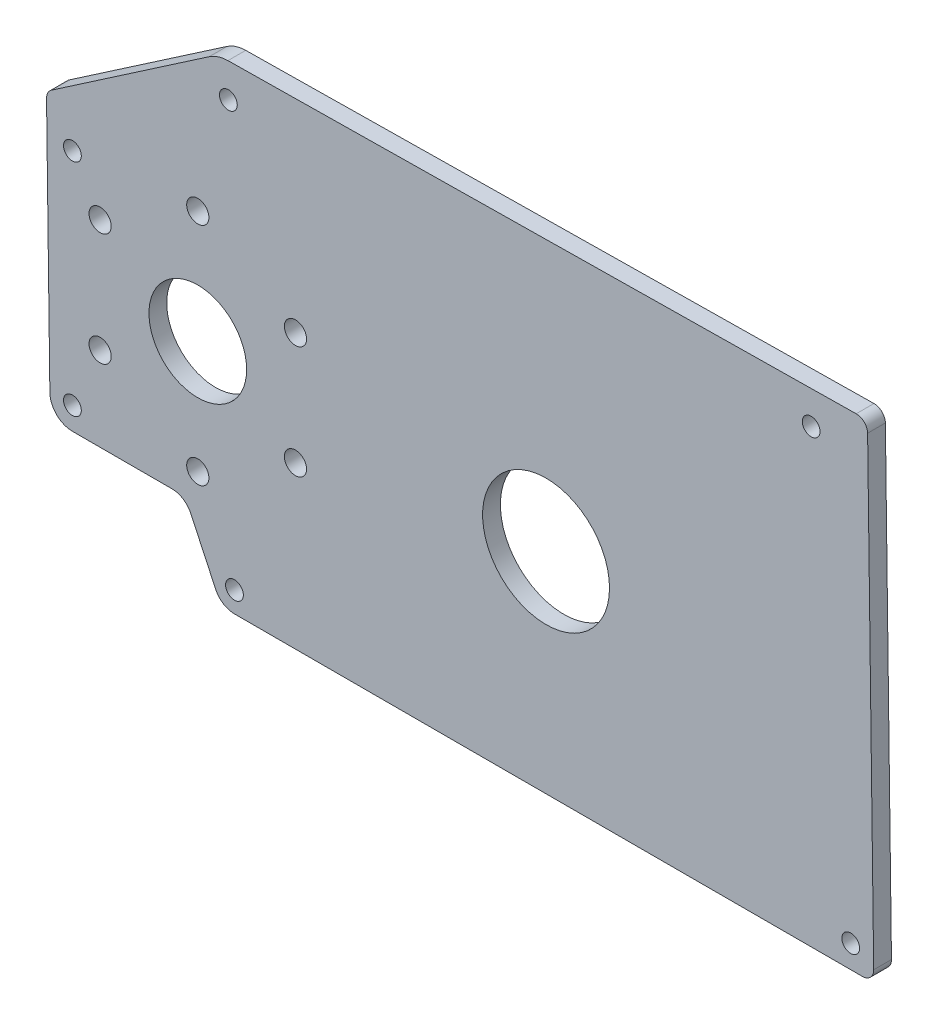
ISO-10303-21;
HEADER;
FILE_DESCRIPTION(('STEP AP214'),'2;1');
FILE_NAME('part.step','',(''),(''),'','','');
FILE_SCHEMA(('AUTOMOTIVE_DESIGN { 1 0 10303 214 1 1 1 1 }'));
ENDSEC;
DATA;
#1=APPLICATION_CONTEXT('core data for automotive mechanical design processes');
#2=APPLICATION_PROTOCOL_DEFINITION('international standard','automotive_design',2000,#1);
#3=PRODUCT_CONTEXT('',#1,'mechanical');
#4=PRODUCT('Part','Part','',(#3));
#5=PRODUCT_RELATED_PRODUCT_CATEGORY('part','',(#4));
#6=PRODUCT_DEFINITION_FORMATION('','',#4);
#7=PRODUCT_DEFINITION_CONTEXT('part definition',#1,'design');
#8=PRODUCT_DEFINITION('design','',#6,#7);
#9=PRODUCT_DEFINITION_SHAPE('','',#8);
#10=(LENGTH_UNIT() NAMED_UNIT(*) SI_UNIT(.MILLI.,.METRE.));
#11=(NAMED_UNIT(*) PLANE_ANGLE_UNIT() SI_UNIT($,.RADIAN.));
#12=(NAMED_UNIT(*) SI_UNIT($,.STERADIAN.) SOLID_ANGLE_UNIT());
#13=UNCERTAINTY_MEASURE_WITH_UNIT(LENGTH_MEASURE(1.E-05),#10,'distance_accuracy_value','');
#14=(GEOMETRIC_REPRESENTATION_CONTEXT(3) GLOBAL_UNCERTAINTY_ASSIGNED_CONTEXT((#13)) GLOBAL_UNIT_ASSIGNED_CONTEXT((#10,
#11,#12)) REPRESENTATION_CONTEXT('',''));
#15=CARTESIAN_POINT('',(0.,0.,0.));
#16=DIRECTION('',(0.,0.,1.));
#17=DIRECTION('',(1.,0.,0.));
#18=AXIS2_PLACEMENT_3D('',#15,#16,#17);
#19=CARTESIAN_POINT('',(30.2662459890792,33.6255082547779,4.));
#20=DIRECTION('',(0.,0.,1.));
#21=DIRECTION('',(1.,0.,0.));
#22=AXIS2_PLACEMENT_3D('',#19,#20,#21);
#23=PLANE('',#22);
#24=CARTESIAN_POINT('',(23.3772099057697,-16.9102078282391,4.));
#25=DIRECTION('',(0.,0.,1.));
#26=DIRECTION('',(1.,0.,0.));
#27=AXIS2_PLACEMENT_3D('',#24,#25,#26);
#28=CIRCLE('',#27,11.);
#29=CARTESIAN_POINT('',(34.3772099057697,-16.9102078282391,4.));
#30=VERTEX_POINT('',#29);
#31=EDGE_CURVE('E346',#30,#30,#28,.T.);
#32=ORIENTED_EDGE('',*,*,#31,.F.);
#33=EDGE_LOOP('',(#32));
#34=FACE_BOUND('',#33,.T.);
#35=CARTESIAN_POINT('',(23.3772099057698,8.48979217176094,4.));
#36=DIRECTION('',(0.,0.,1.));
#37=DIRECTION('',(1.,0.,0.));
#38=AXIS2_PLACEMENT_3D('',#35,#36,#37);
#39=CIRCLE('',#38,2.499999953);
#40=CARTESIAN_POINT('',(25.8772098587698,8.48979217176094,4.));
#41=VERTEX_POINT('',#40);
#42=EDGE_CURVE('E334',#41,#41,#39,.T.);
#43=ORIENTED_EDGE('',*,*,#42,.F.);
#44=EDGE_LOOP('',(#43));
#45=FACE_BOUND('',#44,.T.);
#46=CARTESIAN_POINT('',(23.3772099057697,-42.3102078282391,4.));
#47=DIRECTION('',(0.,0.,1.));
#48=DIRECTION('',(1.,0.,0.));
#49=AXIS2_PLACEMENT_3D('',#46,#47,#48);
#50=CIRCLE('',#49,2.499999953);
#51=CARTESIAN_POINT('',(25.8772098587697,-42.3102078282391,4.));
#52=VERTEX_POINT('',#51);
#53=EDGE_CURVE('E322',#52,#52,#50,.T.);
#54=ORIENTED_EDGE('',*,*,#53,.F.);
#55=EDGE_LOOP('',(#54));
#56=FACE_BOUND('',#55,.T.);
#57=CARTESIAN_POINT('',(1.38016464964489,-29.610207828239,4.));
#58=DIRECTION('',(0.,0.,1.));
#59=DIRECTION('',(1.,0.,0.));
#60=AXIS2_PLACEMENT_3D('',#57,#58,#59);
#61=CIRCLE('',#60,2.499999953);
#62=CARTESIAN_POINT('',(3.8801646026449,-29.610207828239,4.));
#63=VERTEX_POINT('',#62);
#64=EDGE_CURVE('E310',#63,#63,#61,.T.);
#65=ORIENTED_EDGE('',*,*,#64,.F.);
#66=EDGE_LOOP('',(#65));
#67=FACE_BOUND('',#66,.T.);
#68=CARTESIAN_POINT('',(-4.85811183989235,6.1453174279259,4.));
#69=DIRECTION('',(0.,0.,1.));
#70=DIRECTION('',(1.,0.,0.));
#71=AXIS2_PLACEMENT_3D('',#68,#69,#70);
#72=CIRCLE('',#71,2.);
#73=CARTESIAN_POINT('',(-2.85811183989235,6.1453174279259,4.));
#74=VERTEX_POINT('',#73);
#75=EDGE_CURVE('E298',#74,#74,#72,.T.);
#76=ORIENTED_EDGE('',*,*,#75,.F.);
#77=EDGE_LOOP('',(#76));
#78=FACE_BOUND('',#77,.T.);
#79=CARTESIAN_POINT('',(31.6332520207642,-61.2646579872688,4.));
#80=DIRECTION('',(0.,0.,1.));
#81=DIRECTION('',(1.,0.,0.));
#82=AXIS2_PLACEMENT_3D('',#79,#80,#81);
#83=CIRCLE('',#82,1.99999999999876);
#84=CARTESIAN_POINT('',(33.633252020763,-61.2646579872688,4.));
#85=VERTEX_POINT('',#84);
#86=EDGE_CURVE('E286',#85,#85,#83,.T.);
#87=ORIENTED_EDGE('',*,*,#86,.F.);
#88=EDGE_LOOP('',(#87));
#89=FACE_BOUND('',#88,.T.);
#90=CARTESIAN_POINT('',(101.811349412124,-18.6490529622797,4.));
#91=DIRECTION('',(0.,0.,1.));
#92=DIRECTION('',(1.,0.,0.));
#93=AXIS2_PLACEMENT_3D('',#90,#91,#92);
#94=CIRCLE('',#93,14.29);
#95=CARTESIAN_POINT('',(116.101349412124,-18.6490529622797,4.));
#96=VERTEX_POINT('',#95);
#97=EDGE_CURVE('E170',#96,#96,#94,.T.);
#98=ORIENTED_EDGE('',*,*,#97,.F.);
#99=EDGE_LOOP('',(#98));
#100=FACE_BOUND('',#99,.T.);
#101=DIRECTION('',(-0.825412157107729,-0.564530575698754,0.));
#102=VECTOR('',#101,1.);
#103=CARTESIAN_POINT('',(-6.61983482671686,17.6294748495068,4.));
#104=LINE('',#103,#102);
#105=CARTESIAN_POINT('',(25.9645230022547,39.9151488919387,4.));
#106=VERTEX_POINT('',#105);
#107=CARTESIAN_POINT('',(-9.58296343211521,15.6028791868787,4.));
#108=VERTEX_POINT('',#107);
#109=EDGE_CURVE('E51',#106,#108,#104,.T.);
#110=ORIENTED_EDGE('',*,*,#109,.T.);
#111=CARTESIAN_POINT('',(-8.14905576984035,13.5063323078251,4.));
#112=DIRECTION('',(0.,0.,1.));
#113=DIRECTION('',(-1.,0.,0.));
#114=AXIS2_PLACEMENT_3D('',#111,#112,#113);
#115=CIRCLE('',#114,2.54000000000003);
#116=CARTESIAN_POINT('',(-10.6888352442123,13.4728625967584,4.));
#117=VERTEX_POINT('',#116);
#118=EDGE_CURVE('E273',#108,#117,#115,.T.);
#119=ORIENTED_EDGE('',*,*,#118,.T.);
#120=DIRECTION('',(0.013177051601079,-0.999913178886598,0.));
#121=VECTOR('',#120,1.);
#122=CARTESIAN_POINT('',(-10.6888352442123,13.4728625967584,4.));
#123=LINE('',#122,#121);
#124=CARTESIAN_POINT('',(-9.93811183989234,-43.494222939777,4.));
#125=VERTEX_POINT('',#124);
#126=EDGE_CURVE('E227',#117,#125,#123,.T.);
#127=ORIENTED_EDGE('',*,*,#126,.T.);
#128=CARTESIAN_POINT('',(-4.85811183989235,-43.494222939777,4.));
#129=DIRECTION('',(0.,0.,1.));
#130=DIRECTION('',(-1.,0.,0.));
#131=AXIS2_PLACEMENT_3D('',#128,#129,#130);
#132=CIRCLE('',#131,5.07999999999999);
#133=CARTESIAN_POINT('',(-4.85811183989251,-48.574222939777,4.));
#134=VERTEX_POINT('',#133);
#135=EDGE_CURVE('E249',#125,#134,#132,.T.);
#136=ORIENTED_EDGE('',*,*,#135,.T.);
#137=DIRECTION('',(1.,0.,0.));
#138=VECTOR('',#137,1.);
#139=CARTESIAN_POINT('',(17.5661326864003,-48.574222939777,4.));
#140=LINE('',#139,#138);
#141=CARTESIAN_POINT('',(17.5661326864003,-48.574222939777,4.));
#142=VERTEX_POINT('',#141);
#143=EDGE_CURVE('E246',#134,#142,#140,.T.);
#144=ORIENTED_EDGE('',*,*,#143,.T.);
#145=CARTESIAN_POINT('',(17.5661326864003,-53.2486600238922,4.));
#146=DIRECTION('',(0.,0.,-1.));
#147=DIRECTION('',(1.,0.,0.));
#148=AXIS2_PLACEMENT_3D('',#145,#146,#147);
#149=CIRCLE('',#148,4.67443708411522);
#150=CARTESIAN_POINT('',(21.8007320590548,-51.2691322502892,4.));
#151=VERTEX_POINT('',#150);
#152=EDGE_CURVE('E248',#142,#151,#149,.T.);
#153=ORIENTED_EDGE('',*,*,#152,.T.);
#154=DIRECTION('',(0.423479391845908,-0.90590573719445,0.));
#155=VECTOR('',#154,1.);
#156=CARTESIAN_POINT('',(21.8007320590548,-51.2691322502892,4.));
#157=LINE('',#156,#155);
#158=CARTESIAN_POINT('',(27.3986526481097,-63.2441857608719,4.));
#159=VERTEX_POINT('',#158);
#160=EDGE_CURVE('E251',#151,#159,#157,.T.);
#161=ORIENTED_EDGE('',*,*,#160,.T.);
#162=CARTESIAN_POINT('',(31.6332520207642,-61.2646579872688,4.));
#163=DIRECTION('',(0.,0.,1.));
#164=DIRECTION('',(-1.,0.,0.));
#165=AXIS2_PLACEMENT_3D('',#162,#163,#164);
#166=CIRCLE('',#165,4.67443708411522);
#167=CARTESIAN_POINT('',(31.6332520207642,-65.9390950713841,4.));
#168=VERTEX_POINT('',#167);
#169=EDGE_CURVE('E257',#159,#168,#166,.T.);
#170=ORIENTED_EDGE('',*,*,#169,.T.);
#171=DIRECTION('',(1.,0.,0.));
#172=VECTOR('',#171,1.);
#173=CARTESIAN_POINT('',(31.6332520207642,-65.9390950713841,4.));
#174=LINE('',#173,#172);
#175=CARTESIAN_POINT('',(173.06117084053,-65.9390950713841,4.));
#176=VERTEX_POINT('',#175);
#177=EDGE_CURVE('E259',#168,#176,#174,.T.);
#178=ORIENTED_EDGE('',*,*,#177,.T.);
#179=CARTESIAN_POINT('',(173.06117084053,-63.3990950713841,4.));
#180=DIRECTION('',(0.,0.,1.));
#181=DIRECTION('',(1.,0.,0.));
#182=AXIS2_PLACEMENT_3D('',#179,#180,#181);
#183=CIRCLE('',#182,2.54);
#184=CARTESIAN_POINT('',(175.600950314902,-63.3656253603173,4.));
#185=VERTEX_POINT('',#184);
#186=EDGE_CURVE('E261',#176,#185,#183,.T.);
#187=ORIENTED_EDGE('',*,*,#186,.T.);
#188=DIRECTION('',(-0.0131770516010996,0.999913178886598,0.));
#189=VECTOR('',#188,1.);
#190=CARTESIAN_POINT('',(174.230829536448,40.6031428069106,4.));
#191=LINE('',#190,#189);
#192=CARTESIAN_POINT('',(174.230829536448,40.6031428069106,4.));
#193=VERTEX_POINT('',#192);
#194=EDGE_CURVE('E147',#185,#193,#191,.T.);
#195=ORIENTED_EDGE('',*,*,#194,.T.);
#196=CARTESIAN_POINT('',(171.691050062076,40.5696730958434,4.));
#197=DIRECTION('',(0.,0.,1.));
#198=DIRECTION('',(1.,0.,0.));
#199=AXIS2_PLACEMENT_3D('',#196,#197,#198);
#200=CIRCLE('',#199,2.54000000000014);
#201=CARTESIAN_POINT('',(171.657580351009,43.1094525702157,4.));
#202=VERTEX_POINT('',#201);
#203=EDGE_CURVE('E141',#193,#202,#200,.T.);
#204=ORIENTED_EDGE('',*,*,#203,.T.);
#205=DIRECTION('',(-0.999913178886598,-0.0131770516010816,0.));
#206=VECTOR('',#205,1.);
#207=CARTESIAN_POINT('',(30.1658368558789,41.2448466778937,4.));
#208=LINE('',#207,#206);
#209=CARTESIAN_POINT('',(30.1658368558789,41.2448466778937,4.));
#210=VERTEX_POINT('',#209);
#211=EDGE_CURVE('E145',#202,#210,#208,.T.);
#212=ORIENTED_EDGE('',*,*,#211,.T.);
#213=CARTESIAN_POINT('',(30.2662459890792,33.6255082547779,4.));
#214=DIRECTION('',(0.,0.,1.));
#215=DIRECTION('',(1.,0.,0.));
#216=AXIS2_PLACEMENT_3D('',#213,#214,#215);
#217=CIRCLE('',#216,7.61999999999999);
#218=EDGE_CURVE('E161',#210,#106,#217,.T.);
#219=ORIENTED_EDGE('',*,*,#218,.T.);
#220=EDGE_LOOP('',(#110,#119,#127,#136,#144,#153,#161,#170,#178,#187,#195,#204,#212,#219));
#221=FACE_BOUND('',#220,.T.);
#222=CARTESIAN_POINT('',(170.426367514816,-60.7757569411194,4.));
#223=DIRECTION('',(0.,0.,1.));
#224=DIRECTION('',(1.,0.,0.));
#225=AXIS2_PLACEMENT_3D('',#222,#223,#224);
#226=CIRCLE('',#225,2.);
#227=CARTESIAN_POINT('',(172.426367514816,-60.7757569411194,4.));
#228=VERTEX_POINT('',#227);
#229=EDGE_CURVE('E280',#228,#228,#226,.T.);
#230=ORIENTED_EDGE('',*,*,#229,.F.);
#231=EDGE_LOOP('',(#230));
#232=FACE_BOUND('',#231,.T.);
#233=CARTESIAN_POINT('',(161.513898191031,35.5525164901844,4.));
#234=DIRECTION('',(0.,0.,1.));
#235=DIRECTION('',(1.,0.,0.));
#236=AXIS2_PLACEMENT_3D('',#233,#234,#235);
#237=CIRCLE('',#236,2.);
#238=CARTESIAN_POINT('',(163.513898191031,35.5525164901844,4.));
#239=VERTEX_POINT('',#238);
#240=EDGE_CURVE('E292',#239,#239,#237,.T.);
#241=ORIENTED_EDGE('',*,*,#240,.F.);
#242=EDGE_LOOP('',(#241));
#243=FACE_BOUND('',#242,.T.);
#244=CARTESIAN_POINT('',(-4.85811183989235,-43.494222939777,4.));
#245=DIRECTION('',(0.,0.,1.));
#246=DIRECTION('',(1.,0.,0.));
#247=AXIS2_PLACEMENT_3D('',#244,#245,#246);
#248=CIRCLE('',#247,2.);
#249=CARTESIAN_POINT('',(-2.85811183989234,-43.494222939777,4.));
#250=VERTEX_POINT('',#249);
#251=EDGE_CURVE('E304',#250,#250,#248,.T.);
#252=ORIENTED_EDGE('',*,*,#251,.F.);
#253=EDGE_LOOP('',(#252));
#254=FACE_BOUND('',#253,.T.);
#255=CARTESIAN_POINT('',(30.2662459890792,33.6255082547779,4.));
#256=DIRECTION('',(0.,0.,1.));
#257=DIRECTION('',(1.,0.,0.));
#258=AXIS2_PLACEMENT_3D('',#255,#256,#257);
#259=CIRCLE('',#258,1.99999999998389);
#260=CARTESIAN_POINT('',(32.2662459890631,33.6255082547779,4.));
#261=VERTEX_POINT('',#260);
#262=EDGE_CURVE('E316',#261,#261,#259,.T.);
#263=ORIENTED_EDGE('',*,*,#262,.F.);
#264=EDGE_LOOP('',(#263));
#265=FACE_BOUND('',#264,.T.);
#266=CARTESIAN_POINT('',(1.38016464964499,-4.21020782823896,4.));
#267=DIRECTION('',(0.,0.,1.));
#268=DIRECTION('',(1.,0.,0.));
#269=AXIS2_PLACEMENT_3D('',#266,#267,#268);
#270=CIRCLE('',#269,2.499999953);
#271=CARTESIAN_POINT('',(3.880164602645,-4.21020782823896,4.));
#272=VERTEX_POINT('',#271);
#273=EDGE_CURVE('E328',#272,#272,#270,.T.);
#274=ORIENTED_EDGE('',*,*,#273,.F.);
#275=EDGE_LOOP('',(#274));
#276=FACE_BOUND('',#275,.T.);
#277=CARTESIAN_POINT('',(45.3742551618945,-4.21020782823927,4.));
#278=DIRECTION('',(0.,0.,1.));
#279=DIRECTION('',(1.,0.,0.));
#280=AXIS2_PLACEMENT_3D('',#277,#278,#279);
#281=CIRCLE('',#280,2.499999953);
#282=CARTESIAN_POINT('',(47.8742551148945,-4.21020782823927,4.));
#283=VERTEX_POINT('',#282);
#284=EDGE_CURVE('E340',#283,#283,#281,.T.);
#285=ORIENTED_EDGE('',*,*,#284,.F.);
#286=EDGE_LOOP('',(#285));
#287=FACE_BOUND('',#286,.T.);
#288=CARTESIAN_POINT('',(45.3742551618942,-29.6102078282393,4.));
#289=DIRECTION('',(0.,0.,1.));
#290=DIRECTION('',(1.,0.,0.));
#291=AXIS2_PLACEMENT_3D('',#288,#289,#290);
#292=CIRCLE('',#291,2.499999953);
#293=CARTESIAN_POINT('',(47.8742551148943,-29.6102078282393,4.));
#294=VERTEX_POINT('',#293);
#295=EDGE_CURVE('E352',#294,#294,#292,.T.);
#296=ORIENTED_EDGE('',*,*,#295,.F.);
#297=EDGE_LOOP('',(#296));
#298=FACE_BOUND('',#297,.T.);
#299=ADVANCED_FACE('F34',(#34,#45,#56,#67,#78,#89,#100,#221,#232,#243,#254,#265,#276,#287,#298),
#23,.T.);
#300=CARTESIAN_POINT('',(30.2662459890792,33.6255082547779,0.));
#301=DIRECTION('',(0.,0.,1.));
#302=DIRECTION('',(1.,0.,0.));
#303=AXIS2_PLACEMENT_3D('',#300,#301,#302);
#304=PLANE('',#303);
#305=CARTESIAN_POINT('',(-8.14905576984035,13.5063323078251,0.));
#306=DIRECTION('',(0.,0.,1.));
#307=DIRECTION('',(-1.,0.,0.));
#308=AXIS2_PLACEMENT_3D('',#305,#306,#307);
#309=CIRCLE('',#308,2.54000000000003);
#310=CARTESIAN_POINT('',(-9.58296343211521,15.6028791868787,0.));
#311=VERTEX_POINT('',#310);
#312=CARTESIAN_POINT('',(-10.6888352442123,13.4728625967584,0.));
#313=VERTEX_POINT('',#312);
#314=EDGE_CURVE('E167',#311,#313,#309,.T.);
#315=ORIENTED_EDGE('',*,*,#314,.F.);
#316=DIRECTION('',(-0.825412157107728,-0.564530575698754,0.));
#317=VECTOR('',#316,1.);
#318=CARTESIAN_POINT('',(16.768305703793,33.6255082547779,0.));
#319=LINE('',#318,#317);
#320=CARTESIAN_POINT('',(25.9645230022547,39.9151488919387,0.));
#321=VERTEX_POINT('',#320);
#322=EDGE_CURVE('E192',#321,#311,#319,.T.);
#323=ORIENTED_EDGE('',*,*,#322,.F.);
#324=CARTESIAN_POINT('',(30.2662459890792,33.6255082547779,0.));
#325=DIRECTION('',(0.,0.,1.));
#326=DIRECTION('',(1.,0.,0.));
#327=AXIS2_PLACEMENT_3D('',#324,#325,#326);
#328=CIRCLE('',#327,7.61999999999999);
#329=CARTESIAN_POINT('',(30.1658368558789,41.2448466778937,0.));
#330=VERTEX_POINT('',#329);
#331=EDGE_CURVE('E106',#330,#321,#328,.T.);
#332=ORIENTED_EDGE('',*,*,#331,.F.);
#333=DIRECTION('',(-0.999913178886598,-0.0131770516010816,0.));
#334=VECTOR('',#333,1.);
#335=CARTESIAN_POINT('',(30.1658368558789,41.2448466778937,0.));
#336=LINE('',#335,#334);
#337=CARTESIAN_POINT('',(171.657580351009,43.1094525702157,0.));
#338=VERTEX_POINT('',#337);
#339=EDGE_CURVE('E99',#338,#330,#336,.T.);
#340=ORIENTED_EDGE('',*,*,#339,.F.);
#341=CARTESIAN_POINT('',(171.691050062076,40.5696730958434,0.));
#342=DIRECTION('',(0.,0.,1.));
#343=DIRECTION('',(1.,0.,0.));
#344=AXIS2_PLACEMENT_3D('',#341,#342,#343);
#345=CIRCLE('',#344,2.54000000000014);
#346=CARTESIAN_POINT('',(174.230829536448,40.6031428069106,0.));
#347=VERTEX_POINT('',#346);
#348=EDGE_CURVE('E155',#347,#338,#345,.T.);
#349=ORIENTED_EDGE('',*,*,#348,.F.);
#350=DIRECTION('',(-0.0131770516010996,0.999913178886598,0.));
#351=VECTOR('',#350,1.);
#352=CARTESIAN_POINT('',(174.230829536448,40.6031428069106,0.));
#353=LINE('',#352,#351);
#354=CARTESIAN_POINT('',(175.600950314902,-63.3656253603173,0.));
#355=VERTEX_POINT('',#354);
#356=EDGE_CURVE('E187',#355,#347,#353,.T.);
#357=ORIENTED_EDGE('',*,*,#356,.F.);
#358=CARTESIAN_POINT('',(173.06117084053,-63.3990950713841,0.));
#359=DIRECTION('',(0.,0.,1.));
#360=DIRECTION('',(1.,0.,0.));
#361=AXIS2_PLACEMENT_3D('',#358,#359,#360);
#362=CIRCLE('',#361,2.54);
#363=CARTESIAN_POINT('',(173.06117084053,-65.9390950713841,0.));
#364=VERTEX_POINT('',#363);
#365=EDGE_CURVE('E185',#364,#355,#362,.T.);
#366=ORIENTED_EDGE('',*,*,#365,.F.);
#367=DIRECTION('',(1.,0.,0.));
#368=VECTOR('',#367,1.);
#369=CARTESIAN_POINT('',(66.5235655991573,-65.9390950713841,0.));
#370=LINE('',#369,#368);
#371=CARTESIAN_POINT('',(31.6332520207642,-65.9390950713841,0.));
#372=VERTEX_POINT('',#371);
#373=EDGE_CURVE('E183',#372,#364,#370,.T.);
#374=ORIENTED_EDGE('',*,*,#373,.F.);
#375=CARTESIAN_POINT('',(31.6332520207642,-61.2646579872688,0.));
#376=DIRECTION('',(0.,0.,1.));
#377=DIRECTION('',(-1.,0.,0.));
#378=AXIS2_PLACEMENT_3D('',#375,#376,#377);
#379=CIRCLE('',#378,4.67443708411522);
#380=CARTESIAN_POINT('',(27.3986526481097,-63.2441857608719,0.));
#381=VERTEX_POINT('',#380);
#382=EDGE_CURVE('E180',#381,#372,#379,.T.);
#383=ORIENTED_EDGE('',*,*,#382,.F.);
#384=DIRECTION('',(0.423479391845908,-0.90590573719445,0.));
#385=VECTOR('',#384,1.);
#386=CARTESIAN_POINT('',(21.8007320590548,-51.2691322502892,0.));
#387=LINE('',#386,#385);
#388=CARTESIAN_POINT('',(21.8007320590548,-51.2691322502892,0.));
#389=VERTEX_POINT('',#388);
#390=EDGE_CURVE('E178',#389,#381,#387,.T.);
#391=ORIENTED_EDGE('',*,*,#390,.F.);
#392=CARTESIAN_POINT('',(17.5661326864003,-53.2486600238922,0.));
#393=DIRECTION('',(0.,0.,-1.));
#394=DIRECTION('',(1.,0.,0.));
#395=AXIS2_PLACEMENT_3D('',#392,#393,#394);
#396=CIRCLE('',#395,4.67443708411522);
#397=CARTESIAN_POINT('',(17.5661326864003,-48.574222939777,0.));
#398=VERTEX_POINT('',#397);
#399=EDGE_CURVE('E176',#398,#389,#396,.T.);
#400=ORIENTED_EDGE('',*,*,#399,.F.);
#401=DIRECTION('',(1.,0.,0.));
#402=VECTOR('',#401,1.);
#403=CARTESIAN_POINT('',(17.5661326864003,-48.574222939777,0.));
#404=LINE('',#403,#402);
#405=CARTESIAN_POINT('',(-4.85811183989251,-48.574222939777,0.));
#406=VERTEX_POINT('',#405);
#407=EDGE_CURVE('E174',#406,#398,#404,.T.);
#408=ORIENTED_EDGE('',*,*,#407,.F.);
#409=CARTESIAN_POINT('',(-4.85811183989235,-43.494222939777,0.));
#410=DIRECTION('',(0.,0.,1.));
#411=DIRECTION('',(-1.,0.,0.));
#412=AXIS2_PLACEMENT_3D('',#409,#410,#411);
#413=CIRCLE('',#412,5.07999999999999);
#414=CARTESIAN_POINT('',(-9.93811183989234,-43.494222939777,0.));
#415=VERTEX_POINT('',#414);
#416=EDGE_CURVE('E172',#415,#406,#413,.T.);
#417=ORIENTED_EDGE('',*,*,#416,.F.);
#418=DIRECTION('',(0.013177051601079,-0.999913178886598,0.));
#419=VECTOR('',#418,1.);
#420=CARTESIAN_POINT('',(-10.6888352442123,13.4728625967584,0.));
#421=LINE('',#420,#419);
#422=EDGE_CURVE('E169',#313,#415,#421,.T.);
#423=ORIENTED_EDGE('',*,*,#422,.F.);
#424=EDGE_LOOP('',(#315,#323,#332,#340,#349,#357,#366,#374,#383,#391,#400,#408,#417,#423));
#425=FACE_BOUND('',#424,.T.);
#426=CARTESIAN_POINT('',(101.811349412124,-18.6490529622797,0.));
#427=DIRECTION('',(0.,0.,1.));
#428=DIRECTION('',(1.,0.,0.));
#429=AXIS2_PLACEMENT_3D('',#426,#427,#428);
#430=CIRCLE('',#429,14.29);
#431=CARTESIAN_POINT('',(116.101349412124,-18.6490529622797,0.));
#432=VERTEX_POINT('',#431);
#433=EDGE_CURVE('E277',#432,#432,#430,.T.);
#434=ORIENTED_EDGE('',*,*,#433,.T.);
#435=EDGE_LOOP('',(#434));
#436=FACE_BOUND('',#435,.T.);
#437=CARTESIAN_POINT('',(170.426367514816,-60.7757569411194,0.));
#438=DIRECTION('',(0.,0.,1.));
#439=DIRECTION('',(1.,0.,0.));
#440=AXIS2_PLACEMENT_3D('',#437,#438,#439);
#441=CIRCLE('',#440,2.);
#442=CARTESIAN_POINT('',(172.426367514816,-60.7757569411194,0.));
#443=VERTEX_POINT('',#442);
#444=EDGE_CURVE('E283',#443,#443,#441,.T.);
#445=ORIENTED_EDGE('',*,*,#444,.T.);
#446=EDGE_LOOP('',(#445));
#447=FACE_BOUND('',#446,.T.);
#448=CARTESIAN_POINT('',(31.6332520207642,-61.2646579872688,0.));
#449=DIRECTION('',(0.,0.,1.));
#450=DIRECTION('',(1.,0.,0.));
#451=AXIS2_PLACEMENT_3D('',#448,#449,#450);
#452=CIRCLE('',#451,1.99999999999876);
#453=CARTESIAN_POINT('',(33.633252020763,-61.2646579872688,0.));
#454=VERTEX_POINT('',#453);
#455=EDGE_CURVE('E289',#454,#454,#452,.T.);
#456=ORIENTED_EDGE('',*,*,#455,.T.);
#457=EDGE_LOOP('',(#456));
#458=FACE_BOUND('',#457,.T.);
#459=CARTESIAN_POINT('',(161.513898191031,35.5525164901844,0.));
#460=DIRECTION('',(0.,0.,1.));
#461=DIRECTION('',(1.,0.,0.));
#462=AXIS2_PLACEMENT_3D('',#459,#460,#461);
#463=CIRCLE('',#462,2.);
#464=CARTESIAN_POINT('',(163.513898191031,35.5525164901844,0.));
#465=VERTEX_POINT('',#464);
#466=EDGE_CURVE('E295',#465,#465,#463,.T.);
#467=ORIENTED_EDGE('',*,*,#466,.T.);
#468=EDGE_LOOP('',(#467));
#469=FACE_BOUND('',#468,.T.);
#470=CARTESIAN_POINT('',(-4.85811183989235,6.1453174279259,0.));
#471=DIRECTION('',(0.,0.,1.));
#472=DIRECTION('',(1.,0.,0.));
#473=AXIS2_PLACEMENT_3D('',#470,#471,#472);
#474=CIRCLE('',#473,2.);
#475=CARTESIAN_POINT('',(-2.85811183989235,6.1453174279259,0.));
#476=VERTEX_POINT('',#475);
#477=EDGE_CURVE('E301',#476,#476,#474,.T.);
#478=ORIENTED_EDGE('',*,*,#477,.T.);
#479=EDGE_LOOP('',(#478));
#480=FACE_BOUND('',#479,.T.);
#481=CARTESIAN_POINT('',(-4.85811183989235,-43.494222939777,0.));
#482=DIRECTION('',(0.,0.,1.));
#483=DIRECTION('',(1.,0.,0.));
#484=AXIS2_PLACEMENT_3D('',#481,#482,#483);
#485=CIRCLE('',#484,2.);
#486=CARTESIAN_POINT('',(-2.85811183989234,-43.494222939777,0.));
#487=VERTEX_POINT('',#486);
#488=EDGE_CURVE('E307',#487,#487,#485,.T.);
#489=ORIENTED_EDGE('',*,*,#488,.T.);
#490=EDGE_LOOP('',(#489));
#491=FACE_BOUND('',#490,.T.);
#492=CARTESIAN_POINT('',(1.38016464964489,-29.610207828239,0.));
#493=DIRECTION('',(0.,0.,1.));
#494=DIRECTION('',(1.,0.,0.));
#495=AXIS2_PLACEMENT_3D('',#492,#493,#494);
#496=CIRCLE('',#495,2.499999953);
#497=CARTESIAN_POINT('',(3.8801646026449,-29.610207828239,0.));
#498=VERTEX_POINT('',#497);
#499=EDGE_CURVE('E313',#498,#498,#496,.T.);
#500=ORIENTED_EDGE('',*,*,#499,.T.);
#501=EDGE_LOOP('',(#500));
#502=FACE_BOUND('',#501,.T.);
#503=CARTESIAN_POINT('',(30.2662459890792,33.6255082547779,0.));
#504=DIRECTION('',(0.,0.,1.));
#505=DIRECTION('',(1.,0.,0.));
#506=AXIS2_PLACEMENT_3D('',#503,#504,#505);
#507=CIRCLE('',#506,1.99999999998389);
#508=CARTESIAN_POINT('',(32.2662459890631,33.6255082547779,0.));
#509=VERTEX_POINT('',#508);
#510=EDGE_CURVE('E319',#509,#509,#507,.T.);
#511=ORIENTED_EDGE('',*,*,#510,.T.);
#512=EDGE_LOOP('',(#511));
#513=FACE_BOUND('',#512,.T.);
#514=CARTESIAN_POINT('',(23.3772099057697,-42.3102078282391,0.));
#515=DIRECTION('',(0.,0.,1.));
#516=DIRECTION('',(1.,0.,0.));
#517=AXIS2_PLACEMENT_3D('',#514,#515,#516);
#518=CIRCLE('',#517,2.499999953);
#519=CARTESIAN_POINT('',(25.8772098587697,-42.3102078282391,0.));
#520=VERTEX_POINT('',#519);
#521=EDGE_CURVE('E325',#520,#520,#518,.T.);
#522=ORIENTED_EDGE('',*,*,#521,.T.);
#523=EDGE_LOOP('',(#522));
#524=FACE_BOUND('',#523,.T.);
#525=CARTESIAN_POINT('',(1.38016464964499,-4.21020782823896,0.));
#526=DIRECTION('',(0.,0.,1.));
#527=DIRECTION('',(1.,0.,0.));
#528=AXIS2_PLACEMENT_3D('',#525,#526,#527);
#529=CIRCLE('',#528,2.499999953);
#530=CARTESIAN_POINT('',(3.880164602645,-4.21020782823896,0.));
#531=VERTEX_POINT('',#530);
#532=EDGE_CURVE('E331',#531,#531,#529,.T.);
#533=ORIENTED_EDGE('',*,*,#532,.T.);
#534=EDGE_LOOP('',(#533));
#535=FACE_BOUND('',#534,.T.);
#536=CARTESIAN_POINT('',(23.3772099057698,8.48979217176094,0.));
#537=DIRECTION('',(0.,0.,1.));
#538=DIRECTION('',(1.,0.,0.));
#539=AXIS2_PLACEMENT_3D('',#536,#537,#538);
#540=CIRCLE('',#539,2.499999953);
#541=CARTESIAN_POINT('',(25.8772098587698,8.48979217176094,0.));
#542=VERTEX_POINT('',#541);
#543=EDGE_CURVE('E337',#542,#542,#540,.T.);
#544=ORIENTED_EDGE('',*,*,#543,.T.);
#545=EDGE_LOOP('',(#544));
#546=FACE_BOUND('',#545,.T.);
#547=CARTESIAN_POINT('',(45.3742551618945,-4.21020782823927,0.));
#548=DIRECTION('',(0.,0.,1.));
#549=DIRECTION('',(1.,0.,0.));
#550=AXIS2_PLACEMENT_3D('',#547,#548,#549);
#551=CIRCLE('',#550,2.499999953);
#552=CARTESIAN_POINT('',(47.8742551148945,-4.21020782823927,0.));
#553=VERTEX_POINT('',#552);
#554=EDGE_CURVE('E343',#553,#553,#551,.T.);
#555=ORIENTED_EDGE('',*,*,#554,.T.);
#556=EDGE_LOOP('',(#555));
#557=FACE_BOUND('',#556,.T.);
#558=CARTESIAN_POINT('',(23.3772099057697,-16.9102078282391,0.));
#559=DIRECTION('',(0.,0.,1.));
#560=DIRECTION('',(1.,0.,0.));
#561=AXIS2_PLACEMENT_3D('',#558,#559,#560);
#562=CIRCLE('',#561,11.);
#563=CARTESIAN_POINT('',(34.3772099057697,-16.9102078282391,0.));
#564=VERTEX_POINT('',#563);
#565=EDGE_CURVE('E349',#564,#564,#562,.T.);
#566=ORIENTED_EDGE('',*,*,#565,.T.);
#567=EDGE_LOOP('',(#566));
#568=FACE_BOUND('',#567,.T.);
#569=CARTESIAN_POINT('',(45.3742551618942,-29.6102078282393,0.));
#570=DIRECTION('',(0.,0.,1.));
#571=DIRECTION('',(1.,0.,0.));
#572=AXIS2_PLACEMENT_3D('',#569,#570,#571);
#573=CIRCLE('',#572,2.499999953);
#574=CARTESIAN_POINT('',(47.8742551148943,-29.6102078282393,0.));
#575=VERTEX_POINT('',#574);
#576=EDGE_CURVE('E355',#575,#575,#573,.T.);
#577=ORIENTED_EDGE('',*,*,#576,.T.);
#578=EDGE_LOOP('',(#577));
#579=FACE_BOUND('',#578,.T.);
#580=ADVANCED_FACE('F233',(#425,#436,#447,#458,#469,#480,#491,#502,#513,#524,#535,#546,#557,
#568,#579),#304,.F.);
#581=CARTESIAN_POINT('',(-8.14905576984035,13.5063323078251,4.));
#582=DIRECTION('',(0.,0.,-1.));
#583=DIRECTION('',(-1.,0.,0.));
#584=AXIS2_PLACEMENT_3D('',#581,#582,#583);
#585=CYLINDRICAL_SURFACE('',#584,2.54000000000003);
#586=ORIENTED_EDGE('',*,*,#314,.T.);
#587=DIRECTION('',(0.,0.,-1.));
#588=VECTOR('',#587,1.);
#589=CARTESIAN_POINT('',(-10.6888352442123,13.4728625967584,4.));
#590=LINE('',#589,#588);
#591=EDGE_CURVE('E43',#117,#313,#590,.T.);
#592=ORIENTED_EDGE('',*,*,#591,.F.);
#593=ORIENTED_EDGE('',*,*,#118,.F.);
#594=DIRECTION('',(0.,0.,-1.));
#595=VECTOR('',#594,1.);
#596=CARTESIAN_POINT('',(-9.58296343211521,15.6028791868787,4.));
#597=LINE('',#596,#595);
#598=EDGE_CURVE('E11',#108,#311,#597,.T.);
#599=ORIENTED_EDGE('',*,*,#598,.T.);
#600=EDGE_LOOP('',(#586,#592,#593,#599));
#601=FACE_BOUND('',#600,.T.);
#602=ADVANCED_FACE('F36',(#601),#585,.T.);
#603=CARTESIAN_POINT('',(-10.6888352442123,13.4728625967584,4.));
#604=DIRECTION('',(0.999913178886599,0.013177051601079,0.));
#605=DIRECTION('',(-0.013177051601079,0.999913178886598,0.));
#606=AXIS2_PLACEMENT_3D('',#603,#604,#605);
#607=PLANE('',#606);
#608=ORIENTED_EDGE('',*,*,#422,.T.);
#609=DIRECTION('',(0.,0.,-1.));
#610=VECTOR('',#609,1.);
#611=CARTESIAN_POINT('',(-9.93811183989234,-43.494222939777,4.));
#612=LINE('',#611,#610);
#613=EDGE_CURVE('E218',#125,#415,#612,.T.);
#614=ORIENTED_EDGE('',*,*,#613,.F.);
#615=ORIENTED_EDGE('',*,*,#126,.F.);
#616=ORIENTED_EDGE('',*,*,#591,.T.);
#617=EDGE_LOOP('',(#608,#614,#615,#616));
#618=FACE_BOUND('',#617,.T.);
#619=ADVANCED_FACE('F225',(#618),#607,.F.);
#620=CARTESIAN_POINT('',(-4.85811183989235,-43.494222939777,4.));
#621=DIRECTION('',(0.,0.,-1.));
#622=DIRECTION('',(-1.,0.,0.));
#623=AXIS2_PLACEMENT_3D('',#620,#621,#622);
#624=CYLINDRICAL_SURFACE('',#623,5.07999999999999);
#625=ORIENTED_EDGE('',*,*,#416,.T.);
#626=DIRECTION('',(0.,0.,-1.));
#627=VECTOR('',#626,1.);
#628=CARTESIAN_POINT('',(-4.85811183989251,-48.574222939777,4.));
#629=LINE('',#628,#627);
#630=EDGE_CURVE('E215',#134,#406,#629,.T.);
#631=ORIENTED_EDGE('',*,*,#630,.F.);
#632=ORIENTED_EDGE('',*,*,#135,.F.);
#633=ORIENTED_EDGE('',*,*,#613,.T.);
#634=EDGE_LOOP('',(#625,#631,#632,#633));
#635=FACE_BOUND('',#634,.T.);
#636=ADVANCED_FACE('F240',(#635),#624,.T.);
#637=CARTESIAN_POINT('',(17.5661326864003,-48.574222939777,4.));
#638=DIRECTION('',(0.,1.,0.));
#639=DIRECTION('',(-1.,0.,0.));
#640=AXIS2_PLACEMENT_3D('',#637,#638,#639);
#641=PLANE('',#640);
#642=ORIENTED_EDGE('',*,*,#407,.T.);
#643=DIRECTION('',(0.,0.,-1.));
#644=VECTOR('',#643,1.);
#645=CARTESIAN_POINT('',(17.5661326864003,-48.574222939777,4.));
#646=LINE('',#645,#644);
#647=EDGE_CURVE('E212',#142,#398,#646,.T.);
#648=ORIENTED_EDGE('',*,*,#647,.F.);
#649=ORIENTED_EDGE('',*,*,#143,.F.);
#650=ORIENTED_EDGE('',*,*,#630,.T.);
#651=EDGE_LOOP('',(#642,#648,#649,#650));
#652=FACE_BOUND('',#651,.T.);
#653=ADVANCED_FACE('F244',(#652),#641,.F.);
#654=CARTESIAN_POINT('',(17.5661326864003,-53.2486600238922,4.));
#655=DIRECTION('',(0.,0.,-1.));
#656=DIRECTION('',(-1.,0.,0.));
#657=AXIS2_PLACEMENT_3D('',#654,#655,#656);
#658=CYLINDRICAL_SURFACE('',#657,4.67443708411522);
#659=ORIENTED_EDGE('',*,*,#399,.T.);
#660=DIRECTION('',(0.,0.,-1.));
#661=VECTOR('',#660,1.);
#662=CARTESIAN_POINT('',(21.8007320590548,-51.2691322502892,4.));
#663=LINE('',#662,#661);
#664=EDGE_CURVE('E209',#151,#389,#663,.T.);
#665=ORIENTED_EDGE('',*,*,#664,.F.);
#666=ORIENTED_EDGE('',*,*,#152,.F.);
#667=ORIENTED_EDGE('',*,*,#647,.T.);
#668=EDGE_LOOP('',(#659,#665,#666,#667));
#669=FACE_BOUND('',#668,.T.);
#670=ADVANCED_FACE('F401',(#669),#658,.F.);
#671=CARTESIAN_POINT('',(21.8007320590548,-51.2691322502892,4.));
#672=DIRECTION('',(0.90590573719445,0.423479391845908,0.));
#673=DIRECTION('',(-0.423479391845908,0.90590573719445,0.));
#674=AXIS2_PLACEMENT_3D('',#671,#672,#673);
#675=PLANE('',#674);
#676=ORIENTED_EDGE('',*,*,#390,.T.);
#677=DIRECTION('',(0.,0.,-1.));
#678=VECTOR('',#677,1.);
#679=CARTESIAN_POINT('',(27.3986526481097,-63.2441857608719,4.));
#680=LINE('',#679,#678);
#681=EDGE_CURVE('E206',#159,#381,#680,.T.);
#682=ORIENTED_EDGE('',*,*,#681,.F.);
#683=ORIENTED_EDGE('',*,*,#160,.F.);
#684=ORIENTED_EDGE('',*,*,#664,.T.);
#685=EDGE_LOOP('',(#676,#682,#683,#684));
#686=FACE_BOUND('',#685,.T.);
#687=ADVANCED_FACE('F397',(#686),#675,.F.);
#688=CARTESIAN_POINT('',(31.6332520207642,-61.2646579872688,4.));
#689=DIRECTION('',(0.,0.,-1.));
#690=DIRECTION('',(-1.,0.,0.));
#691=AXIS2_PLACEMENT_3D('',#688,#689,#690);
#692=CYLINDRICAL_SURFACE('',#691,4.67443708411522);
#693=ORIENTED_EDGE('',*,*,#382,.T.);
#694=DIRECTION('',(0.,0.,-1.));
#695=VECTOR('',#694,1.);
#696=CARTESIAN_POINT('',(31.6332520207642,-65.9390950713841,4.));
#697=LINE('',#696,#695);
#698=EDGE_CURVE('E203',#168,#372,#697,.T.);
#699=ORIENTED_EDGE('',*,*,#698,.F.);
#700=ORIENTED_EDGE('',*,*,#169,.F.);
#701=ORIENTED_EDGE('',*,*,#681,.T.);
#702=EDGE_LOOP('',(#693,#699,#700,#701));
#703=FACE_BOUND('',#702,.T.);
#704=ADVANCED_FACE('F393',(#703),#692,.T.);
#705=CARTESIAN_POINT('',(66.5235655991573,-65.9390950713841,4.));
#706=DIRECTION('',(0.,1.,0.));
#707=DIRECTION('',(-1.,0.,0.));
#708=AXIS2_PLACEMENT_3D('',#705,#706,#707);
#709=PLANE('',#708);
#710=ORIENTED_EDGE('',*,*,#373,.T.);
#711=DIRECTION('',(0.,0.,-1.));
#712=VECTOR('',#711,1.);
#713=CARTESIAN_POINT('',(173.06117084053,-65.9390950713841,4.));
#714=LINE('',#713,#712);
#715=EDGE_CURVE('E200',#176,#364,#714,.T.);
#716=ORIENTED_EDGE('',*,*,#715,.F.);
#717=ORIENTED_EDGE('',*,*,#177,.F.);
#718=ORIENTED_EDGE('',*,*,#698,.T.);
#719=EDGE_LOOP('',(#710,#716,#717,#718));
#720=FACE_BOUND('',#719,.T.);
#721=ADVANCED_FACE('F390',(#720),#709,.F.);
#722=CARTESIAN_POINT('',(173.06117084053,-63.3990950713841,4.));
#723=DIRECTION('',(0.,0.,-1.));
#724=DIRECTION('',(-1.,0.,0.));
#725=AXIS2_PLACEMENT_3D('',#722,#723,#724);
#726=CYLINDRICAL_SURFACE('',#725,2.54);
#727=ORIENTED_EDGE('',*,*,#365,.T.);
#728=DIRECTION('',(0.,0.,-1.));
#729=VECTOR('',#728,1.);
#730=CARTESIAN_POINT('',(175.600950314902,-63.3656253603173,4.));
#731=LINE('',#730,#729);
#732=EDGE_CURVE('E197',#185,#355,#731,.T.);
#733=ORIENTED_EDGE('',*,*,#732,.F.);
#734=ORIENTED_EDGE('',*,*,#186,.F.);
#735=ORIENTED_EDGE('',*,*,#715,.T.);
#736=EDGE_LOOP('',(#727,#733,#734,#735));
#737=FACE_BOUND('',#736,.T.);
#738=ADVANCED_FACE('F267',(#737),#726,.T.);
#739=CARTESIAN_POINT('',(174.230829536448,40.6031428069106,4.));
#740=DIRECTION('',(-0.999913178886598,-0.0131770516010996,0.));
#741=DIRECTION('',(0.0131770516010996,-0.999913178886598,0.));
#742=AXIS2_PLACEMENT_3D('',#739,#740,#741);
#743=PLANE('',#742);
#744=ORIENTED_EDGE('',*,*,#356,.T.);
#745=DIRECTION('',(0.,0.,-1.));
#746=VECTOR('',#745,1.);
#747=CARTESIAN_POINT('',(174.230829536448,40.6031428069106,4.));
#748=LINE('',#747,#746);
#749=EDGE_CURVE('E156',#193,#347,#748,.T.);
#750=ORIENTED_EDGE('',*,*,#749,.F.);
#751=ORIENTED_EDGE('',*,*,#194,.F.);
#752=ORIENTED_EDGE('',*,*,#732,.T.);
#753=EDGE_LOOP('',(#744,#750,#751,#752));
#754=FACE_BOUND('',#753,.T.);
#755=ADVANCED_FACE('F271',(#754),#743,.F.);
#756=CARTESIAN_POINT('',(171.691050062076,40.5696730958434,4.));
#757=DIRECTION('',(0.,0.,-1.));
#758=DIRECTION('',(-1.,0.,0.));
#759=AXIS2_PLACEMENT_3D('',#756,#757,#758);
#760=CYLINDRICAL_SURFACE('',#759,2.54000000000014);
#761=ORIENTED_EDGE('',*,*,#348,.T.);
#762=DIRECTION('',(0.,0.,-1.));
#763=VECTOR('',#762,1.);
#764=CARTESIAN_POINT('',(171.657580351009,43.1094525702157,4.));
#765=LINE('',#764,#763);
#766=EDGE_CURVE('E152',#202,#338,#765,.T.);
#767=ORIENTED_EDGE('',*,*,#766,.F.);
#768=ORIENTED_EDGE('',*,*,#203,.F.);
#769=ORIENTED_EDGE('',*,*,#749,.T.);
#770=EDGE_LOOP('',(#761,#767,#768,#769));
#771=FACE_BOUND('',#770,.T.);
#772=ADVANCED_FACE('F153',(#771),#760,.T.);
#773=CARTESIAN_POINT('',(30.1658368558789,41.2448466778937,4.));
#774=DIRECTION('',(0.0131770516010816,-0.999913178886599,0.));
#775=DIRECTION('',(0.999913178886598,0.0131770516010816,0.));
#776=AXIS2_PLACEMENT_3D('',#773,#774,#775);
#777=PLANE('',#776);
#778=ORIENTED_EDGE('',*,*,#339,.T.);
#779=DIRECTION('',(0.,0.,-1.));
#780=VECTOR('',#779,1.);
#781=CARTESIAN_POINT('',(30.1658368558789,41.2448466778937,4.));
#782=LINE('',#781,#780);
#783=EDGE_CURVE('E157',#210,#330,#782,.T.);
#784=ORIENTED_EDGE('',*,*,#783,.F.);
#785=ORIENTED_EDGE('',*,*,#211,.F.);
#786=ORIENTED_EDGE('',*,*,#766,.T.);
#787=EDGE_LOOP('',(#778,#784,#785,#786));
#788=FACE_BOUND('',#787,.T.);
#789=ADVANCED_FACE('F159',(#788),#777,.F.);
#790=CARTESIAN_POINT('',(30.2662459890792,33.6255082547779,4.));
#791=DIRECTION('',(0.,0.,-1.));
#792=DIRECTION('',(-1.,0.,0.));
#793=AXIS2_PLACEMENT_3D('',#790,#791,#792);
#794=CYLINDRICAL_SURFACE('',#793,7.61999999999999);
#795=ORIENTED_EDGE('',*,*,#331,.T.);
#796=DIRECTION('',(0.,0.,-1.));
#797=VECTOR('',#796,1.);
#798=CARTESIAN_POINT('',(25.9645230022547,39.9151488919387,4.));
#799=LINE('',#798,#797);
#800=EDGE_CURVE('E163',#106,#321,#799,.T.);
#801=ORIENTED_EDGE('',*,*,#800,.F.);
#802=ORIENTED_EDGE('',*,*,#218,.F.);
#803=ORIENTED_EDGE('',*,*,#783,.T.);
#804=EDGE_LOOP('',(#795,#801,#802,#803));
#805=FACE_BOUND('',#804,.T.);
#806=ADVANCED_FACE('F379',(#805),#794,.T.);
#807=CARTESIAN_POINT('',(16.768305703793,33.6255082547779,4.));
#808=DIRECTION('',(0.564530575698754,-0.825412157107728,0.));
#809=DIRECTION('',(0.825412157107728,0.564530575698754,0.));
#810=AXIS2_PLACEMENT_3D('',#807,#808,#809);
#811=PLANE('',#810);
#812=ORIENTED_EDGE('',*,*,#322,.T.);
#813=ORIENTED_EDGE('',*,*,#598,.F.);
#814=ORIENTED_EDGE('',*,*,#109,.F.);
#815=ORIENTED_EDGE('',*,*,#800,.T.);
#816=EDGE_LOOP('',(#812,#813,#814,#815));
#817=FACE_BOUND('',#816,.T.);
#818=ADVANCED_FACE('F272',(#817),#811,.F.);
#819=CARTESIAN_POINT('',(101.811349412124,-18.6490529622797,4.));
#820=DIRECTION('',(0.,0.,-1.));
#821=DIRECTION('',(-1.,0.,0.));
#822=AXIS2_PLACEMENT_3D('',#819,#820,#821);
#823=CYLINDRICAL_SURFACE('',#822,14.29);
#824=ORIENTED_EDGE('',*,*,#97,.T.);
#825=EDGE_LOOP('',(#824));
#826=FACE_BOUND('',#825,.T.);
#827=ORIENTED_EDGE('',*,*,#433,.F.);
#828=EDGE_LOOP('',(#827));
#829=FACE_BOUND('',#828,.T.);
#830=ADVANCED_FACE('F374',(#826,#829),#823,.F.);
#831=CARTESIAN_POINT('',(170.426367514816,-60.7757569411194,4.));
#832=DIRECTION('',(0.,0.,-1.));
#833=DIRECTION('',(-1.,0.,0.));
#834=AXIS2_PLACEMENT_3D('',#831,#832,#833);
#835=CYLINDRICAL_SURFACE('',#834,2.);
#836=ORIENTED_EDGE('',*,*,#229,.T.);
#837=EDGE_LOOP('',(#836));
#838=FACE_BOUND('',#837,.T.);
#839=ORIENTED_EDGE('',*,*,#444,.F.);
#840=EDGE_LOOP('',(#839));
#841=FACE_BOUND('',#840,.T.);
#842=ADVANCED_FACE('F508',(#838,#841),#835,.F.);
#843=CARTESIAN_POINT('',(31.6332520207642,-61.2646579872688,4.));
#844=DIRECTION('',(0.,0.,-1.));
#845=DIRECTION('',(-1.,0.,0.));
#846=AXIS2_PLACEMENT_3D('',#843,#844,#845);
#847=CYLINDRICAL_SURFACE('',#846,1.99999999999876);
#848=ORIENTED_EDGE('',*,*,#86,.T.);
#849=EDGE_LOOP('',(#848));
#850=FACE_BOUND('',#849,.T.);
#851=ORIENTED_EDGE('',*,*,#455,.F.);
#852=EDGE_LOOP('',(#851));
#853=FACE_BOUND('',#852,.T.);
#854=ADVANCED_FACE('F516',(#850,#853),#847,.F.);
#855=CARTESIAN_POINT('',(161.513898191031,35.5525164901844,4.));
#856=DIRECTION('',(0.,0.,-1.));
#857=DIRECTION('',(-1.,0.,0.));
#858=AXIS2_PLACEMENT_3D('',#855,#856,#857);
#859=CYLINDRICAL_SURFACE('',#858,2.);
#860=ORIENTED_EDGE('',*,*,#240,.T.);
#861=EDGE_LOOP('',(#860));
#862=FACE_BOUND('',#861,.T.);
#863=ORIENTED_EDGE('',*,*,#466,.F.);
#864=EDGE_LOOP('',(#863));
#865=FACE_BOUND('',#864,.T.);
#866=ADVANCED_FACE('F524',(#862,#865),#859,.F.);
#867=CARTESIAN_POINT('',(-4.85811183989235,6.1453174279259,4.));
#868=DIRECTION('',(0.,0.,-1.));
#869=DIRECTION('',(-1.,0.,0.));
#870=AXIS2_PLACEMENT_3D('',#867,#868,#869);
#871=CYLINDRICAL_SURFACE('',#870,2.);
#872=ORIENTED_EDGE('',*,*,#75,.T.);
#873=EDGE_LOOP('',(#872));
#874=FACE_BOUND('',#873,.T.);
#875=ORIENTED_EDGE('',*,*,#477,.F.);
#876=EDGE_LOOP('',(#875));
#877=FACE_BOUND('',#876,.T.);
#878=ADVANCED_FACE('F533',(#874,#877),#871,.F.);
#879=CARTESIAN_POINT('',(-4.85811183989235,-43.494222939777,4.));
#880=DIRECTION('',(0.,0.,-1.));
#881=DIRECTION('',(-1.,0.,0.));
#882=AXIS2_PLACEMENT_3D('',#879,#880,#881);
#883=CYLINDRICAL_SURFACE('',#882,2.);
#884=ORIENTED_EDGE('',*,*,#251,.T.);
#885=EDGE_LOOP('',(#884));
#886=FACE_BOUND('',#885,.T.);
#887=ORIENTED_EDGE('',*,*,#488,.F.);
#888=EDGE_LOOP('',(#887));
#889=FACE_BOUND('',#888,.T.);
#890=ADVANCED_FACE('F542',(#886,#889),#883,.F.);
#891=CARTESIAN_POINT('',(1.38016464964489,-29.610207828239,4.));
#892=DIRECTION('',(0.,0.,-1.));
#893=DIRECTION('',(-1.,0.,0.));
#894=AXIS2_PLACEMENT_3D('',#891,#892,#893);
#895=CYLINDRICAL_SURFACE('',#894,2.499999953);
#896=ORIENTED_EDGE('',*,*,#64,.T.);
#897=EDGE_LOOP('',(#896));
#898=FACE_BOUND('',#897,.T.);
#899=ORIENTED_EDGE('',*,*,#499,.F.);
#900=EDGE_LOOP('',(#899));
#901=FACE_BOUND('',#900,.T.);
#902=ADVANCED_FACE('F551',(#898,#901),#895,.F.);
#903=CARTESIAN_POINT('',(30.2662459890792,33.6255082547779,4.));
#904=DIRECTION('',(0.,0.,-1.));
#905=DIRECTION('',(-1.,0.,0.));
#906=AXIS2_PLACEMENT_3D('',#903,#904,#905);
#907=CYLINDRICAL_SURFACE('',#906,1.99999999998389);
#908=ORIENTED_EDGE('',*,*,#262,.T.);
#909=EDGE_LOOP('',(#908));
#910=FACE_BOUND('',#909,.T.);
#911=ORIENTED_EDGE('',*,*,#510,.F.);
#912=EDGE_LOOP('',(#911));
#913=FACE_BOUND('',#912,.T.);
#914=ADVANCED_FACE('F560',(#910,#913),#907,.F.);
#915=CARTESIAN_POINT('',(23.3772099057697,-42.3102078282391,4.));
#916=DIRECTION('',(0.,0.,-1.));
#917=DIRECTION('',(-1.,0.,0.));
#918=AXIS2_PLACEMENT_3D('',#915,#916,#917);
#919=CYLINDRICAL_SURFACE('',#918,2.499999953);
#920=ORIENTED_EDGE('',*,*,#53,.T.);
#921=EDGE_LOOP('',(#920));
#922=FACE_BOUND('',#921,.T.);
#923=ORIENTED_EDGE('',*,*,#521,.F.);
#924=EDGE_LOOP('',(#923));
#925=FACE_BOUND('',#924,.T.);
#926=ADVANCED_FACE('F569',(#922,#925),#919,.F.);
#927=CARTESIAN_POINT('',(1.38016464964499,-4.21020782823896,4.));
#928=DIRECTION('',(0.,0.,-1.));
#929=DIRECTION('',(-1.,0.,0.));
#930=AXIS2_PLACEMENT_3D('',#927,#928,#929);
#931=CYLINDRICAL_SURFACE('',#930,2.499999953);
#932=ORIENTED_EDGE('',*,*,#273,.T.);
#933=EDGE_LOOP('',(#932));
#934=FACE_BOUND('',#933,.T.);
#935=ORIENTED_EDGE('',*,*,#532,.F.);
#936=EDGE_LOOP('',(#935));
#937=FACE_BOUND('',#936,.T.);
#938=ADVANCED_FACE('F578',(#934,#937),#931,.F.);
#939=CARTESIAN_POINT('',(23.3772099057698,8.48979217176094,4.));
#940=DIRECTION('',(0.,0.,-1.));
#941=DIRECTION('',(-1.,0.,0.));
#942=AXIS2_PLACEMENT_3D('',#939,#940,#941);
#943=CYLINDRICAL_SURFACE('',#942,2.499999953);
#944=ORIENTED_EDGE('',*,*,#42,.T.);
#945=EDGE_LOOP('',(#944));
#946=FACE_BOUND('',#945,.T.);
#947=ORIENTED_EDGE('',*,*,#543,.F.);
#948=EDGE_LOOP('',(#947));
#949=FACE_BOUND('',#948,.T.);
#950=ADVANCED_FACE('F587',(#946,#949),#943,.F.);
#951=CARTESIAN_POINT('',(45.3742551618945,-4.21020782823927,4.));
#952=DIRECTION('',(0.,0.,-1.));
#953=DIRECTION('',(-1.,0.,0.));
#954=AXIS2_PLACEMENT_3D('',#951,#952,#953);
#955=CYLINDRICAL_SURFACE('',#954,2.499999953);
#956=ORIENTED_EDGE('',*,*,#284,.T.);
#957=EDGE_LOOP('',(#956));
#958=FACE_BOUND('',#957,.T.);
#959=ORIENTED_EDGE('',*,*,#554,.F.);
#960=EDGE_LOOP('',(#959));
#961=FACE_BOUND('',#960,.T.);
#962=ADVANCED_FACE('F596',(#958,#961),#955,.F.);
#963=CARTESIAN_POINT('',(23.3772099057697,-16.9102078282391,4.));
#964=DIRECTION('',(0.,0.,-1.));
#965=DIRECTION('',(-1.,0.,0.));
#966=AXIS2_PLACEMENT_3D('',#963,#964,#965);
#967=CYLINDRICAL_SURFACE('',#966,11.);
#968=ORIENTED_EDGE('',*,*,#31,.T.);
#969=EDGE_LOOP('',(#968));
#970=FACE_BOUND('',#969,.T.);
#971=ORIENTED_EDGE('',*,*,#565,.F.);
#972=EDGE_LOOP('',(#971));
#973=FACE_BOUND('',#972,.T.);
#974=ADVANCED_FACE('F605',(#970,#973),#967,.F.);
#975=CARTESIAN_POINT('',(45.3742551618942,-29.6102078282393,4.));
#976=DIRECTION('',(0.,0.,-1.));
#977=DIRECTION('',(-1.,0.,0.));
#978=AXIS2_PLACEMENT_3D('',#975,#976,#977);
#979=CYLINDRICAL_SURFACE('',#978,2.499999953);
#980=ORIENTED_EDGE('',*,*,#295,.T.);
#981=EDGE_LOOP('',(#980));
#982=FACE_BOUND('',#981,.T.);
#983=ORIENTED_EDGE('',*,*,#576,.F.);
#984=EDGE_LOOP('',(#983));
#985=FACE_BOUND('',#984,.T.);
#986=ADVANCED_FACE('F361',(#982,#985),#979,.F.);
#987=CLOSED_SHELL('',(#299,#580,#602,#619,#636,#653,#670,#687,#704,#721,#738,#755,#772,#789,
#806,#818,#830,#842,#854,#866,#878,#890,#902,#914,#926,#938,#950,#962,#974,#986));
#988=MANIFOLD_SOLID_BREP('B2',#987);
#989=ADVANCED_BREP_SHAPE_REPRESENTATION('',(#18,#988),#14);
#990=SHAPE_DEFINITION_REPRESENTATION(#9,#989);
ENDSEC;
END-ISO-10303-21;
